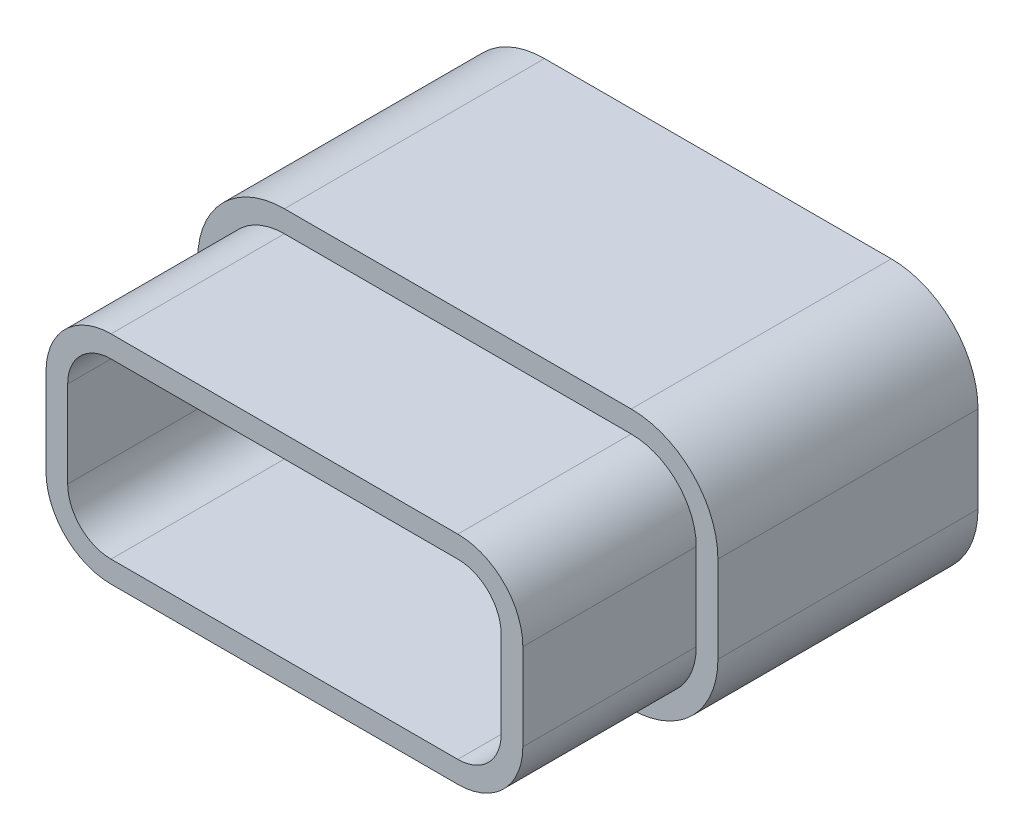
ISO-10303-21;
HEADER;
FILE_DESCRIPTION(('STEP AP214'),'2;1');
FILE_NAME('part.step','',(''),(''),'','','');
FILE_SCHEMA(('AUTOMOTIVE_DESIGN { 1 0 10303 214 1 1 1 1 }'));
ENDSEC;
DATA;
#1=APPLICATION_CONTEXT('core data for automotive mechanical design processes');
#2=APPLICATION_PROTOCOL_DEFINITION('international standard','automotive_design',2000,#1);
#3=PRODUCT_CONTEXT('',#1,'mechanical');
#4=PRODUCT('Part','Part','',(#3));
#5=PRODUCT_RELATED_PRODUCT_CATEGORY('part','',(#4));
#6=PRODUCT_DEFINITION_FORMATION('','',#4);
#7=PRODUCT_DEFINITION_CONTEXT('part definition',#1,'design');
#8=PRODUCT_DEFINITION('design','',#6,#7);
#9=PRODUCT_DEFINITION_SHAPE('','',#8);
#10=(LENGTH_UNIT() NAMED_UNIT(*) SI_UNIT(.MILLI.,.METRE.));
#11=(NAMED_UNIT(*) PLANE_ANGLE_UNIT() SI_UNIT($,.RADIAN.));
#12=(NAMED_UNIT(*) SI_UNIT($,.STERADIAN.) SOLID_ANGLE_UNIT());
#13=UNCERTAINTY_MEASURE_WITH_UNIT(LENGTH_MEASURE(1.E-05),#10,'distance_accuracy_value','');
#14=(GEOMETRIC_REPRESENTATION_CONTEXT(3) GLOBAL_UNCERTAINTY_ASSIGNED_CONTEXT((#13)) GLOBAL_UNIT_ASSIGNED_CONTEXT((#10,
#11,#12)) REPRESENTATION_CONTEXT('',''));
#15=CARTESIAN_POINT('',(0.,0.,0.));
#16=DIRECTION('',(0.,0.,1.));
#17=DIRECTION('',(1.,0.,0.));
#18=AXIS2_PLACEMENT_3D('',#15,#16,#17);
#19=CARTESIAN_POINT('',(40.,-10.,0.));
#20=DIRECTION('',(0.,0.,1.));
#21=DIRECTION('',(1.,0.,0.));
#22=AXIS2_PLACEMENT_3D('',#19,#20,#21);
#23=PLANE('',#22);
#24=CARTESIAN_POINT('',(40.,-10.,0.));
#25=DIRECTION('',(0.,0.,1.));
#26=DIRECTION('',(1.,0.,0.));
#27=AXIS2_PLACEMENT_3D('',#24,#25,#26);
#28=CIRCLE('',#27,20.);
#29=CARTESIAN_POINT('',(39.9999999999999,-30.,0.));
#30=VERTEX_POINT('',#29);
#31=CARTESIAN_POINT('',(60.,-9.99999999999986,0.));
#32=VERTEX_POINT('',#31);
#33=EDGE_CURVE('E815',#30,#32,#28,.T.);
#34=ORIENTED_EDGE('',*,*,#33,.F.);
#35=DIRECTION('',(1.,0.,0.));
#36=VECTOR('',#35,1.);
#37=CARTESIAN_POINT('',(-39.9999999999999,-30.,0.));
#38=LINE('',#37,#36);
#39=CARTESIAN_POINT('',(-39.9999999999999,-30.,0.));
#40=VERTEX_POINT('',#39);
#41=EDGE_CURVE('E895',#40,#30,#38,.T.);
#42=ORIENTED_EDGE('',*,*,#41,.F.);
#43=CARTESIAN_POINT('',(-40.,-10.,0.));
#44=DIRECTION('',(0.,0.,1.));
#45=DIRECTION('',(-1.,0.,0.));
#46=AXIS2_PLACEMENT_3D('',#43,#44,#45);
#47=CIRCLE('',#46,20.);
#48=CARTESIAN_POINT('',(-60.,-10.,0.));
#49=VERTEX_POINT('',#48);
#50=EDGE_CURVE('E891',#49,#40,#47,.T.);
#51=ORIENTED_EDGE('',*,*,#50,.F.);
#52=DIRECTION('',(0.,-1.,0.));
#53=VECTOR('',#52,1.);
#54=CARTESIAN_POINT('',(-60.,-9.99999999999986,0.));
#55=LINE('',#54,#53);
#56=CARTESIAN_POINT('',(-60.,9.99999999999986,0.));
#57=VERTEX_POINT('',#56);
#58=EDGE_CURVE('E887',#57,#49,#55,.T.);
#59=ORIENTED_EDGE('',*,*,#58,.F.);
#60=CARTESIAN_POINT('',(-40.,10.,0.));
#61=DIRECTION('',(0.,0.,1.));
#62=DIRECTION('',(-1.,0.,0.));
#63=AXIS2_PLACEMENT_3D('',#60,#61,#62);
#64=CIRCLE('',#63,20.);
#65=CARTESIAN_POINT('',(-39.9999999999999,30.,0.));
#66=VERTEX_POINT('',#65);
#67=EDGE_CURVE('E883',#66,#57,#64,.T.);
#68=ORIENTED_EDGE('',*,*,#67,.F.);
#69=DIRECTION('',(-1.,0.,0.));
#70=VECTOR('',#69,1.);
#71=CARTESIAN_POINT('',(-39.9999999999999,30.,0.));
#72=LINE('',#71,#70);
#73=CARTESIAN_POINT('',(39.9999999999999,30.,0.));
#74=VERTEX_POINT('',#73);
#75=EDGE_CURVE('E879',#74,#66,#72,.T.);
#76=ORIENTED_EDGE('',*,*,#75,.F.);
#77=CARTESIAN_POINT('',(40.,10.,0.));
#78=DIRECTION('',(0.,0.,1.));
#79=DIRECTION('',(-1.,0.,0.));
#80=AXIS2_PLACEMENT_3D('',#77,#78,#79);
#81=CIRCLE('',#80,20.);
#82=CARTESIAN_POINT('',(60.,9.99999999999986,0.));
#83=VERTEX_POINT('',#82);
#84=EDGE_CURVE('E875',#83,#74,#81,.T.);
#85=ORIENTED_EDGE('',*,*,#84,.F.);
#86=DIRECTION('',(0.,1.,0.));
#87=VECTOR('',#86,1.);
#88=CARTESIAN_POINT('',(60.,-9.99999999999986,0.));
#89=LINE('',#88,#87);
#90=EDGE_CURVE('E871',#32,#83,#89,.T.);
#91=ORIENTED_EDGE('',*,*,#90,.F.);
#92=EDGE_LOOP('',(#34,#42,#51,#59,#68,#76,#85,#91));
#93=FACE_BOUND('',#92,.T.);
#94=DIRECTION('',(0.,-1.,0.));
#95=VECTOR('',#94,1.);
#96=CARTESIAN_POINT('',(-55.,-10.,0.));
#97=LINE('',#96,#95);
#98=CARTESIAN_POINT('',(-55.,9.9999999999999,0.));
#99=VERTEX_POINT('',#98);
#100=CARTESIAN_POINT('',(-55.,-10.,0.));
#101=VERTEX_POINT('',#100);
#102=EDGE_CURVE('E651',#99,#101,#97,.T.);
#103=ORIENTED_EDGE('',*,*,#102,.T.);
#104=CARTESIAN_POINT('',(-40.,-10.,0.));
#105=DIRECTION('',(0.,0.,1.));
#106=DIRECTION('',(1.,0.,0.));
#107=AXIS2_PLACEMENT_3D('',#104,#105,#106);
#108=CIRCLE('',#107,15.);
#109=CARTESIAN_POINT('',(-39.9999999999999,-25.,0.));
#110=VERTEX_POINT('',#109);
#111=EDGE_CURVE('E647',#101,#110,#108,.T.);
#112=ORIENTED_EDGE('',*,*,#111,.T.);
#113=DIRECTION('',(1.,0.,0.));
#114=VECTOR('',#113,1.);
#115=CARTESIAN_POINT('',(40.,-25.,0.));
#116=LINE('',#115,#114);
#117=CARTESIAN_POINT('',(39.9999999999998,-25.,0.));
#118=VERTEX_POINT('',#117);
#119=EDGE_CURVE('E388',#110,#118,#116,.T.);
#120=ORIENTED_EDGE('',*,*,#119,.T.);
#121=CARTESIAN_POINT('',(40.,-10.,0.));
#122=DIRECTION('',(0.,0.,1.));
#123=DIRECTION('',(1.,0.,0.));
#124=AXIS2_PLACEMENT_3D('',#121,#122,#123);
#125=CIRCLE('',#124,15.);
#126=CARTESIAN_POINT('',(55.,-9.99999999999986,0.));
#127=VERTEX_POINT('',#126);
#128=EDGE_CURVE('E641',#118,#127,#125,.T.);
#129=ORIENTED_EDGE('',*,*,#128,.T.);
#130=DIRECTION('',(0.,1.,0.));
#131=VECTOR('',#130,1.);
#132=CARTESIAN_POINT('',(55.,-10.,0.));
#133=LINE('',#132,#131);
#134=CARTESIAN_POINT('',(55.,10.,0.));
#135=VERTEX_POINT('',#134);
#136=EDGE_CURVE('E637',#127,#135,#133,.T.);
#137=ORIENTED_EDGE('',*,*,#136,.T.);
#138=CARTESIAN_POINT('',(40.,10.,0.));
#139=DIRECTION('',(0.,0.,1.));
#140=DIRECTION('',(1.,0.,0.));
#141=AXIS2_PLACEMENT_3D('',#138,#139,#140);
#142=CIRCLE('',#141,15.);
#143=CARTESIAN_POINT('',(39.9999999999999,25.,0.));
#144=VERTEX_POINT('',#143);
#145=EDGE_CURVE('E634',#135,#144,#142,.T.);
#146=ORIENTED_EDGE('',*,*,#145,.T.);
#147=DIRECTION('',(-1.,0.,0.));
#148=VECTOR('',#147,1.);
#149=CARTESIAN_POINT('',(40.,25.,0.));
#150=LINE('',#149,#148);
#151=CARTESIAN_POINT('',(-39.9999999999999,25.,0.));
#152=VERTEX_POINT('',#151);
#153=EDGE_CURVE('E586',#144,#152,#150,.T.);
#154=ORIENTED_EDGE('',*,*,#153,.T.);
#155=CARTESIAN_POINT('',(-40.,10.,0.));
#156=DIRECTION('',(0.,0.,1.));
#157=DIRECTION('',(1.,0.,0.));
#158=AXIS2_PLACEMENT_3D('',#155,#156,#157);
#159=CIRCLE('',#158,15.);
#160=EDGE_CURVE('E607',#152,#99,#159,.T.);
#161=ORIENTED_EDGE('',*,*,#160,.T.);
#162=EDGE_LOOP('',(#103,#112,#120,#129,#137,#146,#154,#161));
#163=FACE_BOUND('',#162,.T.);
#164=ADVANCED_FACE('F372',(#93,#163),#23,.F.);
#165=CARTESIAN_POINT('',(40.,-10.,100.));
#166=DIRECTION('',(0.,0.,-1.));
#167=DIRECTION('',(-1.,0.,0.));
#168=AXIS2_PLACEMENT_3D('',#165,#166,#167);
#169=CYLINDRICAL_SURFACE('',#168,20.);
#170=CARTESIAN_POINT('',(40.,-10.,60.));
#171=DIRECTION('',(0.,0.,1.));
#172=DIRECTION('',(1.,0.,0.));
#173=AXIS2_PLACEMENT_3D('',#170,#171,#172);
#174=CIRCLE('',#173,20.);
#175=CARTESIAN_POINT('',(39.9999999999999,-30.,60.));
#176=VERTEX_POINT('',#175);
#177=CARTESIAN_POINT('',(60.,-9.99999999999986,60.));
#178=VERTEX_POINT('',#177);
#179=EDGE_CURVE('E699',#176,#178,#174,.T.);
#180=ORIENTED_EDGE('',*,*,#179,.F.);
#181=DIRECTION('',(0.,0.,-1.));
#182=VECTOR('',#181,1.);
#183=CARTESIAN_POINT('',(39.9999999999999,-30.,100.));
#184=LINE('',#183,#182);
#185=EDGE_CURVE('E899',#176,#30,#184,.T.);
#186=ORIENTED_EDGE('',*,*,#185,.T.);
#187=ORIENTED_EDGE('',*,*,#33,.T.);
#188=DIRECTION('',(0.,0.,-1.));
#189=VECTOR('',#188,1.);
#190=CARTESIAN_POINT('',(60.,-9.99999999999986,100.));
#191=LINE('',#190,#189);
#192=EDGE_CURVE('E381',#178,#32,#191,.T.);
#193=ORIENTED_EDGE('',*,*,#192,.F.);
#194=EDGE_LOOP('',(#180,#186,#187,#193));
#195=FACE_BOUND('',#194,.T.);
#196=ADVANCED_FACE('F374',(#195),#169,.T.);
#197=CARTESIAN_POINT('',(60.,-9.99999999999986,100.));
#198=DIRECTION('',(-1.,0.,0.));
#199=DIRECTION('',(0.,0.,1.));
#200=AXIS2_PLACEMENT_3D('',#197,#198,#199);
#201=PLANE('',#200);
#202=DIRECTION('',(0.,1.,0.));
#203=VECTOR('',#202,1.);
#204=CARTESIAN_POINT('',(60.,-9.99999999999986,60.));
#205=LINE('',#204,#203);
#206=CARTESIAN_POINT('',(60.,9.99999999999986,60.));
#207=VERTEX_POINT('',#206);
#208=EDGE_CURVE('E702',#178,#207,#205,.T.);
#209=ORIENTED_EDGE('',*,*,#208,.F.);
#210=ORIENTED_EDGE('',*,*,#192,.T.);
#211=ORIENTED_EDGE('',*,*,#90,.T.);
#212=DIRECTION('',(0.,0.,-1.));
#213=VECTOR('',#212,1.);
#214=CARTESIAN_POINT('',(60.,9.99999999999986,100.));
#215=LINE('',#214,#213);
#216=EDGE_CURVE('E917',#207,#83,#215,.T.);
#217=ORIENTED_EDGE('',*,*,#216,.F.);
#218=EDGE_LOOP('',(#209,#210,#211,#217));
#219=FACE_BOUND('',#218,.T.);
#220=ADVANCED_FACE('F924',(#219),#201,.F.);
#221=CARTESIAN_POINT('',(40.,10.,100.));
#222=DIRECTION('',(0.,0.,-1.));
#223=DIRECTION('',(-1.,0.,0.));
#224=AXIS2_PLACEMENT_3D('',#221,#222,#223);
#225=CYLINDRICAL_SURFACE('',#224,20.);
#226=CARTESIAN_POINT('',(40.,10.,60.));
#227=DIRECTION('',(0.,0.,1.));
#228=DIRECTION('',(-1.,0.,0.));
#229=AXIS2_PLACEMENT_3D('',#226,#227,#228);
#230=CIRCLE('',#229,20.);
#231=CARTESIAN_POINT('',(39.9999999999999,30.,60.));
#232=VERTEX_POINT('',#231);
#233=EDGE_CURVE('E706',#207,#232,#230,.T.);
#234=ORIENTED_EDGE('',*,*,#233,.F.);
#235=ORIENTED_EDGE('',*,*,#216,.T.);
#236=ORIENTED_EDGE('',*,*,#84,.T.);
#237=DIRECTION('',(0.,0.,-1.));
#238=VECTOR('',#237,1.);
#239=CARTESIAN_POINT('',(39.9999999999999,30.,100.));
#240=LINE('',#239,#238);
#241=EDGE_CURVE('E914',#232,#74,#240,.T.);
#242=ORIENTED_EDGE('',*,*,#241,.F.);
#243=EDGE_LOOP('',(#234,#235,#236,#242));
#244=FACE_BOUND('',#243,.T.);
#245=ADVANCED_FACE('F960',(#244),#225,.T.);
#246=CARTESIAN_POINT('',(-39.9999999999999,30.,100.));
#247=DIRECTION('',(0.,-1.,0.));
#248=DIRECTION('',(0.,0.,-1.));
#249=AXIS2_PLACEMENT_3D('',#246,#247,#248);
#250=PLANE('',#249);
#251=DIRECTION('',(-1.,0.,0.));
#252=VECTOR('',#251,1.);
#253=CARTESIAN_POINT('',(-39.9999999999999,30.,60.));
#254=LINE('',#253,#252);
#255=CARTESIAN_POINT('',(-39.9999999999999,30.,60.));
#256=VERTEX_POINT('',#255);
#257=EDGE_CURVE('E709',#232,#256,#254,.T.);
#258=ORIENTED_EDGE('',*,*,#257,.F.);
#259=ORIENTED_EDGE('',*,*,#241,.T.);
#260=ORIENTED_EDGE('',*,*,#75,.T.);
#261=DIRECTION('',(0.,0.,-1.));
#262=VECTOR('',#261,1.);
#263=CARTESIAN_POINT('',(-39.9999999999999,30.,100.));
#264=LINE('',#263,#262);
#265=EDGE_CURVE('E911',#256,#66,#264,.T.);
#266=ORIENTED_EDGE('',*,*,#265,.F.);
#267=EDGE_LOOP('',(#258,#259,#260,#266));
#268=FACE_BOUND('',#267,.T.);
#269=ADVANCED_FACE('F956',(#268),#250,.F.);
#270=CARTESIAN_POINT('',(-40.,10.,100.));
#271=DIRECTION('',(0.,0.,-1.));
#272=DIRECTION('',(-1.,0.,0.));
#273=AXIS2_PLACEMENT_3D('',#270,#271,#272);
#274=CYLINDRICAL_SURFACE('',#273,20.);
#275=CARTESIAN_POINT('',(-40.,10.,60.));
#276=DIRECTION('',(0.,0.,1.));
#277=DIRECTION('',(-1.,0.,0.));
#278=AXIS2_PLACEMENT_3D('',#275,#276,#277);
#279=CIRCLE('',#278,20.);
#280=CARTESIAN_POINT('',(-60.,9.99999999999986,60.));
#281=VERTEX_POINT('',#280);
#282=EDGE_CURVE('E712',#256,#281,#279,.T.);
#283=ORIENTED_EDGE('',*,*,#282,.F.);
#284=ORIENTED_EDGE('',*,*,#265,.T.);
#285=ORIENTED_EDGE('',*,*,#67,.T.);
#286=DIRECTION('',(0.,0.,-1.));
#287=VECTOR('',#286,1.);
#288=CARTESIAN_POINT('',(-60.,9.99999999999986,100.));
#289=LINE('',#288,#287);
#290=EDGE_CURVE('E908',#281,#57,#289,.T.);
#291=ORIENTED_EDGE('',*,*,#290,.F.);
#292=EDGE_LOOP('',(#283,#284,#285,#291));
#293=FACE_BOUND('',#292,.T.);
#294=ADVANCED_FACE('F952',(#293),#274,.T.);
#295=CARTESIAN_POINT('',(-60.,-9.99999999999986,100.));
#296=DIRECTION('',(1.,0.,0.));
#297=DIRECTION('',(0.,0.,-1.));
#298=AXIS2_PLACEMENT_3D('',#295,#296,#297);
#299=PLANE('',#298);
#300=DIRECTION('',(0.,-1.,0.));
#301=VECTOR('',#300,1.);
#302=CARTESIAN_POINT('',(-60.,-9.99999999999986,60.));
#303=LINE('',#302,#301);
#304=CARTESIAN_POINT('',(-60.,-10.,60.));
#305=VERTEX_POINT('',#304);
#306=EDGE_CURVE('E715',#281,#305,#303,.T.);
#307=ORIENTED_EDGE('',*,*,#306,.F.);
#308=ORIENTED_EDGE('',*,*,#290,.T.);
#309=ORIENTED_EDGE('',*,*,#58,.T.);
#310=DIRECTION('',(0.,0.,-1.));
#311=VECTOR('',#310,1.);
#312=CARTESIAN_POINT('',(-60.,-10.,100.));
#313=LINE('',#312,#311);
#314=EDGE_CURVE('E905',#305,#49,#313,.T.);
#315=ORIENTED_EDGE('',*,*,#314,.F.);
#316=EDGE_LOOP('',(#307,#308,#309,#315));
#317=FACE_BOUND('',#316,.T.);
#318=ADVANCED_FACE('F948',(#317),#299,.F.);
#319=CARTESIAN_POINT('',(-40.,-10.,100.));
#320=DIRECTION('',(0.,0.,-1.));
#321=DIRECTION('',(-1.,0.,0.));
#322=AXIS2_PLACEMENT_3D('',#319,#320,#321);
#323=CYLINDRICAL_SURFACE('',#322,20.);
#324=CARTESIAN_POINT('',(-40.,-10.,60.));
#325=DIRECTION('',(0.,0.,1.));
#326=DIRECTION('',(-1.,0.,0.));
#327=AXIS2_PLACEMENT_3D('',#324,#325,#326);
#328=CIRCLE('',#327,20.);
#329=CARTESIAN_POINT('',(-39.9999999999999,-30.,60.));
#330=VERTEX_POINT('',#329);
#331=EDGE_CURVE('E718',#305,#330,#328,.T.);
#332=ORIENTED_EDGE('',*,*,#331,.F.);
#333=ORIENTED_EDGE('',*,*,#314,.T.);
#334=ORIENTED_EDGE('',*,*,#50,.T.);
#335=DIRECTION('',(0.,0.,-1.));
#336=VECTOR('',#335,1.);
#337=CARTESIAN_POINT('',(-39.9999999999999,-30.,100.));
#338=LINE('',#337,#336);
#339=EDGE_CURVE('E902',#330,#40,#338,.T.);
#340=ORIENTED_EDGE('',*,*,#339,.F.);
#341=EDGE_LOOP('',(#332,#333,#334,#340));
#342=FACE_BOUND('',#341,.T.);
#343=ADVANCED_FACE('F944',(#342),#323,.T.);
#344=CARTESIAN_POINT('',(-39.9999999999999,-30.,100.));
#345=DIRECTION('',(0.,1.,0.));
#346=DIRECTION('',(0.,0.,1.));
#347=AXIS2_PLACEMENT_3D('',#344,#345,#346);
#348=PLANE('',#347);
#349=DIRECTION('',(1.,0.,0.));
#350=VECTOR('',#349,1.);
#351=CARTESIAN_POINT('',(-39.9999999999999,-30.,60.));
#352=LINE('',#351,#350);
#353=EDGE_CURVE('E721',#330,#176,#352,.T.);
#354=ORIENTED_EDGE('',*,*,#353,.F.);
#355=ORIENTED_EDGE('',*,*,#339,.T.);
#356=ORIENTED_EDGE('',*,*,#41,.T.);
#357=ORIENTED_EDGE('',*,*,#185,.F.);
#358=EDGE_LOOP('',(#354,#355,#356,#357));
#359=FACE_BOUND('',#358,.T.);
#360=ADVANCED_FACE('F937',(#359),#348,.F.);
#361=CARTESIAN_POINT('',(40.,-10.,100.));
#362=DIRECTION('',(0.,0.,1.));
#363=DIRECTION('',(1.,0.,0.));
#364=AXIS2_PLACEMENT_3D('',#361,#362,#363);
#365=PLANE('',#364);
#366=CARTESIAN_POINT('',(40.,10.,100.));
#367=DIRECTION('',(0.,0.,1.));
#368=DIRECTION('',(1.,0.,0.));
#369=AXIS2_PLACEMENT_3D('',#366,#367,#368);
#370=CIRCLE('',#369,15.);
#371=CARTESIAN_POINT('',(39.9999999999999,25.,100.));
#372=VERTEX_POINT('',#371);
#373=CARTESIAN_POINT('',(55.,10.,100.));
#374=VERTEX_POINT('',#373);
#375=EDGE_CURVE('E779',#372,#374,#370,.F.);
#376=ORIENTED_EDGE('',*,*,#375,.F.);
#377=DIRECTION('',(1.,0.,0.));
#378=VECTOR('',#377,1.);
#379=CARTESIAN_POINT('',(40.,25.,100.));
#380=LINE('',#379,#378);
#381=CARTESIAN_POINT('',(-39.9999999999999,25.,100.));
#382=VERTEX_POINT('',#381);
#383=EDGE_CURVE('E775',#382,#372,#380,.T.);
#384=ORIENTED_EDGE('',*,*,#383,.F.);
#385=CARTESIAN_POINT('',(-40.,10.,100.));
#386=DIRECTION('',(0.,0.,1.));
#387=DIRECTION('',(1.,0.,0.));
#388=AXIS2_PLACEMENT_3D('',#385,#386,#387);
#389=CIRCLE('',#388,15.);
#390=CARTESIAN_POINT('',(-55.,9.99999999999989,100.));
#391=VERTEX_POINT('',#390);
#392=EDGE_CURVE('E772',#391,#382,#389,.F.);
#393=ORIENTED_EDGE('',*,*,#392,.F.);
#394=DIRECTION('',(0.,1.,0.));
#395=VECTOR('',#394,1.);
#396=CARTESIAN_POINT('',(-55.,-10.,100.));
#397=LINE('',#396,#395);
#398=CARTESIAN_POINT('',(-55.,-10.,100.));
#399=VERTEX_POINT('',#398);
#400=EDGE_CURVE('E768',#399,#391,#397,.T.);
#401=ORIENTED_EDGE('',*,*,#400,.F.);
#402=CARTESIAN_POINT('',(-40.,-10.,100.));
#403=DIRECTION('',(0.,0.,1.));
#404=DIRECTION('',(1.,0.,0.));
#405=AXIS2_PLACEMENT_3D('',#402,#403,#404);
#406=CIRCLE('',#405,15.);
#407=CARTESIAN_POINT('',(-39.9999999999999,-25.,100.));
#408=VERTEX_POINT('',#407);
#409=EDGE_CURVE('E760',#408,#399,#406,.F.);
#410=ORIENTED_EDGE('',*,*,#409,.F.);
#411=DIRECTION('',(-1.,0.,0.));
#412=VECTOR('',#411,1.);
#413=CARTESIAN_POINT('',(40.,-25.,100.));
#414=LINE('',#413,#412);
#415=CARTESIAN_POINT('',(39.9999999999999,-25.,100.));
#416=VERTEX_POINT('',#415);
#417=EDGE_CURVE('E698',#416,#408,#414,.T.);
#418=ORIENTED_EDGE('',*,*,#417,.F.);
#419=CARTESIAN_POINT('',(40.,-10.,100.));
#420=DIRECTION('',(0.,0.,1.));
#421=DIRECTION('',(1.,0.,0.));
#422=AXIS2_PLACEMENT_3D('',#419,#420,#421);
#423=CIRCLE('',#422,15.);
#424=CARTESIAN_POINT('',(55.,-10.,100.));
#425=VERTEX_POINT('',#424);
#426=EDGE_CURVE('E703',#425,#416,#423,.F.);
#427=ORIENTED_EDGE('',*,*,#426,.F.);
#428=DIRECTION('',(0.,-1.,0.));
#429=VECTOR('',#428,1.);
#430=CARTESIAN_POINT('',(55.,-10.,100.));
#431=LINE('',#430,#429);
#432=EDGE_CURVE('E764',#374,#425,#431,.T.);
#433=ORIENTED_EDGE('',*,*,#432,.F.);
#434=EDGE_LOOP('',(#376,#384,#393,#401,#410,#418,#427,#433));
#435=FACE_BOUND('',#434,.T.);
#436=CARTESIAN_POINT('',(40.,-10.,100.));
#437=DIRECTION('',(0.,0.,1.));
#438=DIRECTION('',(1.,0.,0.));
#439=AXIS2_PLACEMENT_3D('',#436,#437,#438);
#440=CIRCLE('',#439,10.);
#441=CARTESIAN_POINT('',(39.9999999999998,-20.,100.));
#442=VERTEX_POINT('',#441);
#443=CARTESIAN_POINT('',(50.,-9.99999999999986,100.));
#444=VERTEX_POINT('',#443);
#445=EDGE_CURVE('E793',#442,#444,#440,.T.);
#446=ORIENTED_EDGE('',*,*,#445,.F.);
#447=DIRECTION('',(1.,0.,0.));
#448=VECTOR('',#447,1.);
#449=CARTESIAN_POINT('',(-39.9999999999999,-20.,100.));
#450=LINE('',#449,#448);
#451=CARTESIAN_POINT('',(-39.9999999999999,-20.,100.));
#452=VERTEX_POINT('',#451);
#453=EDGE_CURVE('E822',#452,#442,#450,.T.);
#454=ORIENTED_EDGE('',*,*,#453,.F.);
#455=CARTESIAN_POINT('',(-40.,-10.,100.));
#456=DIRECTION('',(0.,0.,1.));
#457=DIRECTION('',(1.,0.,0.));
#458=AXIS2_PLACEMENT_3D('',#455,#456,#457);
#459=CIRCLE('',#458,10.);
#460=CARTESIAN_POINT('',(-50.,-10.,100.));
#461=VERTEX_POINT('',#460);
#462=EDGE_CURVE('E862',#461,#452,#459,.T.);
#463=ORIENTED_EDGE('',*,*,#462,.F.);
#464=DIRECTION('',(0.,-1.,0.));
#465=VECTOR('',#464,1.);
#466=CARTESIAN_POINT('',(-50.,-9.99999999999986,100.));
#467=LINE('',#466,#465);
#468=CARTESIAN_POINT('',(-50.,9.99999999999993,100.));
#469=VERTEX_POINT('',#468);
#470=EDGE_CURVE('E859',#469,#461,#467,.T.);
#471=ORIENTED_EDGE('',*,*,#470,.F.);
#472=CARTESIAN_POINT('',(-40.,10.,100.));
#473=DIRECTION('',(0.,0.,1.));
#474=DIRECTION('',(1.,0.,0.));
#475=AXIS2_PLACEMENT_3D('',#472,#473,#474);
#476=CIRCLE('',#475,10.);
#477=CARTESIAN_POINT('',(-39.9999999999999,20.,100.));
#478=VERTEX_POINT('',#477);
#479=EDGE_CURVE('E856',#478,#469,#476,.T.);
#480=ORIENTED_EDGE('',*,*,#479,.F.);
#481=DIRECTION('',(-1.,0.,0.));
#482=VECTOR('',#481,1.);
#483=CARTESIAN_POINT('',(-39.9999999999999,20.,100.));
#484=LINE('',#483,#482);
#485=CARTESIAN_POINT('',(39.9999999999999,20.,100.));
#486=VERTEX_POINT('',#485);
#487=EDGE_CURVE('E853',#486,#478,#484,.T.);
#488=ORIENTED_EDGE('',*,*,#487,.F.);
#489=CARTESIAN_POINT('',(40.,10.,100.));
#490=DIRECTION('',(0.,0.,1.));
#491=DIRECTION('',(1.,0.,0.));
#492=AXIS2_PLACEMENT_3D('',#489,#490,#491);
#493=CIRCLE('',#492,10.);
#494=CARTESIAN_POINT('',(50.,9.99999999999986,100.));
#495=VERTEX_POINT('',#494);
#496=EDGE_CURVE('E850',#495,#486,#493,.T.);
#497=ORIENTED_EDGE('',*,*,#496,.F.);
#498=DIRECTION('',(0.,1.,0.));
#499=VECTOR('',#498,1.);
#500=CARTESIAN_POINT('',(50.,-9.99999999999986,100.));
#501=LINE('',#500,#499);
#502=EDGE_CURVE('E847',#444,#495,#501,.T.);
#503=ORIENTED_EDGE('',*,*,#502,.F.);
#504=EDGE_LOOP('',(#446,#454,#463,#471,#480,#488,#497,#503));
#505=FACE_BOUND('',#504,.T.);
#506=ADVANCED_FACE('F1000',(#435,#505),#365,.T.);
#507=CARTESIAN_POINT('',(40.,-10.,100.));
#508=DIRECTION('',(0.,0.,-1.));
#509=DIRECTION('',(-1.,0.,0.));
#510=AXIS2_PLACEMENT_3D('',#507,#508,#509);
#511=CYLINDRICAL_SURFACE('',#510,10.);
#512=CARTESIAN_POINT('',(40.,-10.,40.));
#513=DIRECTION('',(0.,0.,1.));
#514=DIRECTION('',(1.,0.,0.));
#515=AXIS2_PLACEMENT_3D('',#512,#513,#514);
#516=CIRCLE('',#515,10.);
#517=CARTESIAN_POINT('',(39.9999999999998,-20.,40.));
#518=VERTEX_POINT('',#517);
#519=CARTESIAN_POINT('',(50.,-9.99999999999986,40.));
#520=VERTEX_POINT('',#519);
#521=EDGE_CURVE('E695',#518,#520,#516,.T.);
#522=ORIENTED_EDGE('',*,*,#521,.F.);
#523=DIRECTION('',(0.,0.,-1.));
#524=VECTOR('',#523,1.);
#525=CARTESIAN_POINT('',(39.9999999999999,-20.,100.));
#526=LINE('',#525,#524);
#527=EDGE_CURVE('E817',#442,#518,#526,.T.);
#528=ORIENTED_EDGE('',*,*,#527,.F.);
#529=ORIENTED_EDGE('',*,*,#445,.T.);
#530=DIRECTION('',(0.,0.,1.));
#531=VECTOR('',#530,1.);
#532=CARTESIAN_POINT('',(50.,-9.99999999999986,100.));
#533=LINE('',#532,#531);
#534=EDGE_CURVE('E811',#444,#520,#533,.F.);
#535=ORIENTED_EDGE('',*,*,#534,.T.);
#536=EDGE_LOOP('',(#522,#528,#529,#535));
#537=FACE_BOUND('',#536,.T.);
#538=ADVANCED_FACE('F1003',(#537),#511,.F.);
#539=CARTESIAN_POINT('',(50.,-9.99999999999986,100.));
#540=DIRECTION('',(-1.,0.,0.));
#541=DIRECTION('',(0.,0.,1.));
#542=AXIS2_PLACEMENT_3D('',#539,#540,#541);
#543=PLANE('',#542);
#544=DIRECTION('',(0.,1.,0.));
#545=VECTOR('',#544,1.);
#546=CARTESIAN_POINT('',(50.,-9.99999999999986,40.));
#547=LINE('',#546,#545);
#548=CARTESIAN_POINT('',(50.,10.,40.));
#549=VERTEX_POINT('',#548);
#550=EDGE_CURVE('E692',#520,#549,#547,.T.);
#551=ORIENTED_EDGE('',*,*,#550,.F.);
#552=ORIENTED_EDGE('',*,*,#534,.F.);
#553=ORIENTED_EDGE('',*,*,#502,.T.);
#554=DIRECTION('',(0.,0.,-1.));
#555=VECTOR('',#554,1.);
#556=CARTESIAN_POINT('',(50.,9.99999999999993,100.));
#557=LINE('',#556,#555);
#558=EDGE_CURVE('E816',#495,#549,#557,.T.);
#559=ORIENTED_EDGE('',*,*,#558,.T.);
#560=EDGE_LOOP('',(#551,#552,#553,#559));
#561=FACE_BOUND('',#560,.T.);
#562=ADVANCED_FACE('F1016',(#561),#543,.T.);
#563=CARTESIAN_POINT('',(40.,10.,100.));
#564=DIRECTION('',(0.,0.,-1.));
#565=DIRECTION('',(-1.,0.,0.));
#566=AXIS2_PLACEMENT_3D('',#563,#564,#565);
#567=CYLINDRICAL_SURFACE('',#566,10.);
#568=CARTESIAN_POINT('',(40.,10.,40.));
#569=DIRECTION('',(0.,0.,1.));
#570=DIRECTION('',(1.,0.,0.));
#571=AXIS2_PLACEMENT_3D('',#568,#569,#570);
#572=CIRCLE('',#571,10.);
#573=CARTESIAN_POINT('',(39.9999999999999,20.,40.));
#574=VERTEX_POINT('',#573);
#575=EDGE_CURVE('E689',#549,#574,#572,.T.);
#576=ORIENTED_EDGE('',*,*,#575,.F.);
#577=ORIENTED_EDGE('',*,*,#558,.F.);
#578=ORIENTED_EDGE('',*,*,#496,.T.);
#579=DIRECTION('',(0.,0.,-1.));
#580=VECTOR('',#579,1.);
#581=CARTESIAN_POINT('',(39.9999999999998,20.,100.));
#582=LINE('',#581,#580);
#583=EDGE_CURVE('E826',#486,#574,#582,.T.);
#584=ORIENTED_EDGE('',*,*,#583,.T.);
#585=EDGE_LOOP('',(#576,#577,#578,#584));
#586=FACE_BOUND('',#585,.T.);
#587=ADVANCED_FACE('F1021',(#586),#567,.F.);
#588=CARTESIAN_POINT('',(-39.9999999999999,20.,100.));
#589=DIRECTION('',(0.,-1.,0.));
#590=DIRECTION('',(0.,0.,-1.));
#591=AXIS2_PLACEMENT_3D('',#588,#589,#590);
#592=PLANE('',#591);
#593=DIRECTION('',(-1.,0.,0.));
#594=VECTOR('',#593,1.);
#595=CARTESIAN_POINT('',(-39.9999999999999,20.,40.));
#596=LINE('',#595,#594);
#597=CARTESIAN_POINT('',(-39.9999999999999,20.,40.));
#598=VERTEX_POINT('',#597);
#599=EDGE_CURVE('E686',#574,#598,#596,.T.);
#600=ORIENTED_EDGE('',*,*,#599,.F.);
#601=ORIENTED_EDGE('',*,*,#583,.F.);
#602=ORIENTED_EDGE('',*,*,#487,.T.);
#603=DIRECTION('',(0.,0.,-1.));
#604=VECTOR('',#603,1.);
#605=CARTESIAN_POINT('',(-39.9999999999999,20.,100.));
#606=LINE('',#605,#604);
#607=EDGE_CURVE('E830',#478,#598,#606,.T.);
#608=ORIENTED_EDGE('',*,*,#607,.T.);
#609=EDGE_LOOP('',(#600,#601,#602,#608));
#610=FACE_BOUND('',#609,.T.);
#611=ADVANCED_FACE('F1025',(#610),#592,.T.);
#612=CARTESIAN_POINT('',(-40.,10.,100.));
#613=DIRECTION('',(0.,0.,-1.));
#614=DIRECTION('',(-1.,0.,0.));
#615=AXIS2_PLACEMENT_3D('',#612,#613,#614);
#616=CYLINDRICAL_SURFACE('',#615,10.);
#617=CARTESIAN_POINT('',(-40.,10.,40.));
#618=DIRECTION('',(0.,0.,1.));
#619=DIRECTION('',(1.,0.,0.));
#620=AXIS2_PLACEMENT_3D('',#617,#618,#619);
#621=CIRCLE('',#620,10.);
#622=CARTESIAN_POINT('',(-50.,9.99999999999993,40.));
#623=VERTEX_POINT('',#622);
#624=EDGE_CURVE('E683',#598,#623,#621,.T.);
#625=ORIENTED_EDGE('',*,*,#624,.F.);
#626=ORIENTED_EDGE('',*,*,#607,.F.);
#627=ORIENTED_EDGE('',*,*,#479,.T.);
#628=DIRECTION('',(0.,0.,-1.));
#629=VECTOR('',#628,1.);
#630=CARTESIAN_POINT('',(-50.,9.99999999999986,100.));
#631=LINE('',#630,#629);
#632=EDGE_CURVE('E834',#469,#623,#631,.T.);
#633=ORIENTED_EDGE('',*,*,#632,.T.);
#634=EDGE_LOOP('',(#625,#626,#627,#633));
#635=FACE_BOUND('',#634,.T.);
#636=ADVANCED_FACE('F1032',(#635),#616,.F.);
#637=CARTESIAN_POINT('',(-50.,-9.99999999999986,100.));
#638=DIRECTION('',(1.,0.,0.));
#639=DIRECTION('',(0.,0.,-1.));
#640=AXIS2_PLACEMENT_3D('',#637,#638,#639);
#641=PLANE('',#640);
#642=DIRECTION('',(0.,-1.,0.));
#643=VECTOR('',#642,1.);
#644=CARTESIAN_POINT('',(-50.,-9.99999999999986,40.));
#645=LINE('',#644,#643);
#646=CARTESIAN_POINT('',(-50.,-10.,40.));
#647=VERTEX_POINT('',#646);
#648=EDGE_CURVE('E680',#623,#647,#645,.T.);
#649=ORIENTED_EDGE('',*,*,#648,.F.);
#650=ORIENTED_EDGE('',*,*,#632,.F.);
#651=ORIENTED_EDGE('',*,*,#470,.T.);
#652=DIRECTION('',(0.,0.,-1.));
#653=VECTOR('',#652,1.);
#654=CARTESIAN_POINT('',(-50.,-10.,100.));
#655=LINE('',#654,#653);
#656=EDGE_CURVE('E838',#461,#647,#655,.T.);
#657=ORIENTED_EDGE('',*,*,#656,.T.);
#658=EDGE_LOOP('',(#649,#650,#651,#657));
#659=FACE_BOUND('',#658,.T.);
#660=ADVANCED_FACE('F1035',(#659),#641,.T.);
#661=CARTESIAN_POINT('',(-40.,-10.,100.));
#662=DIRECTION('',(0.,0.,-1.));
#663=DIRECTION('',(-1.,0.,0.));
#664=AXIS2_PLACEMENT_3D('',#661,#662,#663);
#665=CYLINDRICAL_SURFACE('',#664,10.);
#666=CARTESIAN_POINT('',(-40.,-10.,40.));
#667=DIRECTION('',(0.,0.,1.));
#668=DIRECTION('',(1.,0.,0.));
#669=AXIS2_PLACEMENT_3D('',#666,#667,#668);
#670=CIRCLE('',#669,10.);
#671=CARTESIAN_POINT('',(-39.9999999999999,-20.,40.));
#672=VERTEX_POINT('',#671);
#673=EDGE_CURVE('E395',#647,#672,#670,.T.);
#674=ORIENTED_EDGE('',*,*,#673,.F.);
#675=ORIENTED_EDGE('',*,*,#656,.F.);
#676=ORIENTED_EDGE('',*,*,#462,.T.);
#677=DIRECTION('',(0.,0.,1.));
#678=VECTOR('',#677,1.);
#679=CARTESIAN_POINT('',(-39.9999999999999,-20.,100.));
#680=LINE('',#679,#678);
#681=EDGE_CURVE('E821',#452,#672,#680,.F.);
#682=ORIENTED_EDGE('',*,*,#681,.T.);
#683=EDGE_LOOP('',(#674,#675,#676,#682));
#684=FACE_BOUND('',#683,.T.);
#685=ADVANCED_FACE('F1038',(#684),#665,.F.);
#686=CARTESIAN_POINT('',(-39.9999999999999,-20.,100.));
#687=DIRECTION('',(0.,1.,0.));
#688=DIRECTION('',(0.,0.,1.));
#689=AXIS2_PLACEMENT_3D('',#686,#687,#688);
#690=PLANE('',#689);
#691=DIRECTION('',(1.,0.,0.));
#692=VECTOR('',#691,1.);
#693=CARTESIAN_POINT('',(-39.9999999999999,-20.,40.));
#694=LINE('',#693,#692);
#695=EDGE_CURVE('E13',#672,#518,#694,.T.);
#696=ORIENTED_EDGE('',*,*,#695,.F.);
#697=ORIENTED_EDGE('',*,*,#681,.F.);
#698=ORIENTED_EDGE('',*,*,#453,.T.);
#699=ORIENTED_EDGE('',*,*,#527,.T.);
#700=EDGE_LOOP('',(#696,#697,#698,#699));
#701=FACE_BOUND('',#700,.T.);
#702=ADVANCED_FACE('F1040',(#701),#690,.T.);
#703=CARTESIAN_POINT('',(40.,10.,60.));
#704=DIRECTION('',(0.,0.,1.));
#705=DIRECTION('',(1.,0.,0.));
#706=AXIS2_PLACEMENT_3D('',#703,#704,#705);
#707=CYLINDRICAL_SURFACE('',#706,15.);
#708=ORIENTED_EDGE('',*,*,#375,.T.);
#709=DIRECTION('',(0.,0.,1.));
#710=VECTOR('',#709,1.);
#711=CARTESIAN_POINT('',(55.,10.,60.));
#712=LINE('',#711,#710);
#713=CARTESIAN_POINT('',(55.,10.,60.));
#714=VERTEX_POINT('',#713);
#715=EDGE_CURVE('E789',#714,#374,#712,.T.);
#716=ORIENTED_EDGE('',*,*,#715,.F.);
#717=CARTESIAN_POINT('',(40.,10.,60.));
#718=DIRECTION('',(0.,0.,1.));
#719=DIRECTION('',(1.,0.,0.));
#720=AXIS2_PLACEMENT_3D('',#717,#718,#719);
#721=CIRCLE('',#720,15.);
#722=CARTESIAN_POINT('',(39.9999999999999,25.,60.));
#723=VERTEX_POINT('',#722);
#724=EDGE_CURVE('E750',#723,#714,#721,.F.);
#725=ORIENTED_EDGE('',*,*,#724,.F.);
#726=DIRECTION('',(0.,0.,1.));
#727=VECTOR('',#726,1.);
#728=CARTESIAN_POINT('',(39.9999999999999,25.,60.));
#729=LINE('',#728,#727);
#730=EDGE_CURVE('E733',#723,#372,#729,.T.);
#731=ORIENTED_EDGE('',*,*,#730,.T.);
#732=EDGE_LOOP('',(#708,#716,#725,#731));
#733=FACE_BOUND('',#732,.T.);
#734=ADVANCED_FACE('F973',(#733),#707,.T.);
#735=CARTESIAN_POINT('',(55.,-10.,60.));
#736=DIRECTION('',(-1.,0.,0.));
#737=DIRECTION('',(0.,0.,1.));
#738=AXIS2_PLACEMENT_3D('',#735,#736,#737);
#739=PLANE('',#738);
#740=ORIENTED_EDGE('',*,*,#432,.T.);
#741=DIRECTION('',(0.,0.,1.));
#742=VECTOR('',#741,1.);
#743=CARTESIAN_POINT('',(55.,-10.,60.));
#744=LINE('',#743,#742);
#745=CARTESIAN_POINT('',(55.,-10.,60.));
#746=VERTEX_POINT('',#745);
#747=EDGE_CURVE('E786',#746,#425,#744,.T.);
#748=ORIENTED_EDGE('',*,*,#747,.F.);
#749=DIRECTION('',(0.,-1.,0.));
#750=VECTOR('',#749,1.);
#751=CARTESIAN_POINT('',(55.,-10.,60.));
#752=LINE('',#751,#750);
#753=EDGE_CURVE('E734',#714,#746,#752,.T.);
#754=ORIENTED_EDGE('',*,*,#753,.F.);
#755=ORIENTED_EDGE('',*,*,#715,.T.);
#756=EDGE_LOOP('',(#740,#748,#754,#755));
#757=FACE_BOUND('',#756,.T.);
#758=ADVANCED_FACE('F977',(#757),#739,.F.);
#759=CARTESIAN_POINT('',(40.,-10.,60.));
#760=DIRECTION('',(0.,0.,1.));
#761=DIRECTION('',(1.,0.,0.));
#762=AXIS2_PLACEMENT_3D('',#759,#760,#761);
#763=CYLINDRICAL_SURFACE('',#762,15.);
#764=ORIENTED_EDGE('',*,*,#426,.T.);
#765=DIRECTION('',(0.,0.,1.));
#766=VECTOR('',#765,1.);
#767=CARTESIAN_POINT('',(39.9999999999999,-25.,60.));
#768=LINE('',#767,#766);
#769=CARTESIAN_POINT('',(39.9999999999999,-25.,60.));
#770=VERTEX_POINT('',#769);
#771=EDGE_CURVE('E790',#770,#416,#768,.T.);
#772=ORIENTED_EDGE('',*,*,#771,.F.);
#773=CARTESIAN_POINT('',(40.,-10.,60.));
#774=DIRECTION('',(0.,0.,1.));
#775=DIRECTION('',(1.,0.,0.));
#776=AXIS2_PLACEMENT_3D('',#773,#774,#775);
#777=CIRCLE('',#776,15.);
#778=EDGE_CURVE('E729',#746,#770,#777,.F.);
#779=ORIENTED_EDGE('',*,*,#778,.F.);
#780=ORIENTED_EDGE('',*,*,#747,.T.);
#781=EDGE_LOOP('',(#764,#772,#779,#780));
#782=FACE_BOUND('',#781,.T.);
#783=ADVANCED_FACE('F980',(#782),#763,.T.);
#784=CARTESIAN_POINT('',(40.,-25.,60.));
#785=DIRECTION('',(0.,1.,0.));
#786=DIRECTION('',(0.,0.,1.));
#787=AXIS2_PLACEMENT_3D('',#784,#785,#786);
#788=PLANE('',#787);
#789=ORIENTED_EDGE('',*,*,#417,.T.);
#790=DIRECTION('',(0.,0.,1.));
#791=VECTOR('',#790,1.);
#792=CARTESIAN_POINT('',(-39.9999999999999,-25.,60.));
#793=LINE('',#792,#791);
#794=CARTESIAN_POINT('',(-39.9999999999999,-25.,60.));
#795=VERTEX_POINT('',#794);
#796=EDGE_CURVE('E806',#795,#408,#793,.T.);
#797=ORIENTED_EDGE('',*,*,#796,.F.);
#798=DIRECTION('',(-1.,0.,0.));
#799=VECTOR('',#798,1.);
#800=CARTESIAN_POINT('',(40.,-25.,60.));
#801=LINE('',#800,#799);
#802=EDGE_CURVE('E724',#770,#795,#801,.T.);
#803=ORIENTED_EDGE('',*,*,#802,.F.);
#804=ORIENTED_EDGE('',*,*,#771,.T.);
#805=EDGE_LOOP('',(#789,#797,#803,#804));
#806=FACE_BOUND('',#805,.T.);
#807=ADVANCED_FACE('F985',(#806),#788,.F.);
#808=CARTESIAN_POINT('',(-40.,-10.,60.));
#809=DIRECTION('',(0.,0.,1.));
#810=DIRECTION('',(1.,0.,0.));
#811=AXIS2_PLACEMENT_3D('',#808,#809,#810);
#812=CYLINDRICAL_SURFACE('',#811,15.);
#813=ORIENTED_EDGE('',*,*,#409,.T.);
#814=DIRECTION('',(0.,0.,1.));
#815=VECTOR('',#814,1.);
#816=CARTESIAN_POINT('',(-55.,-10.,60.));
#817=LINE('',#816,#815);
#818=CARTESIAN_POINT('',(-55.,-10.,60.));
#819=VERTEX_POINT('',#818);
#820=EDGE_CURVE('E803',#819,#399,#817,.T.);
#821=ORIENTED_EDGE('',*,*,#820,.F.);
#822=CARTESIAN_POINT('',(-40.,-10.,60.));
#823=DIRECTION('',(0.,0.,1.));
#824=DIRECTION('',(1.,0.,0.));
#825=AXIS2_PLACEMENT_3D('',#822,#823,#824);
#826=CIRCLE('',#825,15.);
#827=EDGE_CURVE('E728',#795,#819,#826,.F.);
#828=ORIENTED_EDGE('',*,*,#827,.F.);
#829=ORIENTED_EDGE('',*,*,#796,.T.);
#830=EDGE_LOOP('',(#813,#821,#828,#829));
#831=FACE_BOUND('',#830,.T.);
#832=ADVANCED_FACE('F988',(#831),#812,.T.);
#833=CARTESIAN_POINT('',(-55.,-10.,60.));
#834=DIRECTION('',(1.,0.,0.));
#835=DIRECTION('',(0.,0.,-1.));
#836=AXIS2_PLACEMENT_3D('',#833,#834,#835);
#837=PLANE('',#836);
#838=ORIENTED_EDGE('',*,*,#400,.T.);
#839=DIRECTION('',(0.,0.,1.));
#840=VECTOR('',#839,1.);
#841=CARTESIAN_POINT('',(-55.,9.99999999999989,60.));
#842=LINE('',#841,#840);
#843=CARTESIAN_POINT('',(-55.,9.99999999999989,60.));
#844=VERTEX_POINT('',#843);
#845=EDGE_CURVE('E800',#844,#391,#842,.T.);
#846=ORIENTED_EDGE('',*,*,#845,.F.);
#847=DIRECTION('',(0.,1.,0.));
#848=VECTOR('',#847,1.);
#849=CARTESIAN_POINT('',(-55.,-10.,60.));
#850=LINE('',#849,#848);
#851=EDGE_CURVE('E738',#819,#844,#850,.T.);
#852=ORIENTED_EDGE('',*,*,#851,.F.);
#853=ORIENTED_EDGE('',*,*,#820,.T.);
#854=EDGE_LOOP('',(#838,#846,#852,#853));
#855=FACE_BOUND('',#854,.T.);
#856=ADVANCED_FACE('F993',(#855),#837,.F.);
#857=CARTESIAN_POINT('',(-40.,10.,60.));
#858=DIRECTION('',(0.,0.,1.));
#859=DIRECTION('',(1.,0.,0.));
#860=AXIS2_PLACEMENT_3D('',#857,#858,#859);
#861=CYLINDRICAL_SURFACE('',#860,15.);
#862=ORIENTED_EDGE('',*,*,#392,.T.);
#863=DIRECTION('',(0.,0.,1.));
#864=VECTOR('',#863,1.);
#865=CARTESIAN_POINT('',(-39.9999999999999,25.,60.));
#866=LINE('',#865,#864);
#867=CARTESIAN_POINT('',(-39.9999999999999,25.,60.));
#868=VERTEX_POINT('',#867);
#869=EDGE_CURVE('E796',#868,#382,#866,.T.);
#870=ORIENTED_EDGE('',*,*,#869,.F.);
#871=CARTESIAN_POINT('',(-40.,10.,60.));
#872=DIRECTION('',(0.,0.,1.));
#873=DIRECTION('',(1.,0.,0.));
#874=AXIS2_PLACEMENT_3D('',#871,#872,#873);
#875=CIRCLE('',#874,15.);
#876=EDGE_CURVE('E742',#844,#868,#875,.F.);
#877=ORIENTED_EDGE('',*,*,#876,.F.);
#878=ORIENTED_EDGE('',*,*,#845,.T.);
#879=EDGE_LOOP('',(#862,#870,#877,#878));
#880=FACE_BOUND('',#879,.T.);
#881=ADVANCED_FACE('F996',(#880),#861,.T.);
#882=CARTESIAN_POINT('',(40.,25.,60.));
#883=DIRECTION('',(0.,-1.,0.));
#884=DIRECTION('',(0.,0.,-1.));
#885=AXIS2_PLACEMENT_3D('',#882,#883,#884);
#886=PLANE('',#885);
#887=ORIENTED_EDGE('',*,*,#383,.T.);
#888=ORIENTED_EDGE('',*,*,#730,.F.);
#889=DIRECTION('',(1.,0.,0.));
#890=VECTOR('',#889,1.);
#891=CARTESIAN_POINT('',(40.,25.,60.));
#892=LINE('',#891,#890);
#893=EDGE_CURVE('E746',#868,#723,#892,.T.);
#894=ORIENTED_EDGE('',*,*,#893,.F.);
#895=ORIENTED_EDGE('',*,*,#869,.T.);
#896=EDGE_LOOP('',(#887,#888,#894,#895));
#897=FACE_BOUND('',#896,.T.);
#898=ADVANCED_FACE('F966',(#897),#886,.F.);
#899=CARTESIAN_POINT('',(40.,-10.,60.));
#900=DIRECTION('',(0.,0.,1.));
#901=DIRECTION('',(1.,0.,0.));
#902=AXIS2_PLACEMENT_3D('',#899,#900,#901);
#903=PLANE('',#902);
#904=ORIENTED_EDGE('',*,*,#179,.T.);
#905=ORIENTED_EDGE('',*,*,#208,.T.);
#906=ORIENTED_EDGE('',*,*,#233,.T.);
#907=ORIENTED_EDGE('',*,*,#257,.T.);
#908=ORIENTED_EDGE('',*,*,#282,.T.);
#909=ORIENTED_EDGE('',*,*,#306,.T.);
#910=ORIENTED_EDGE('',*,*,#331,.T.);
#911=ORIENTED_EDGE('',*,*,#353,.T.);
#912=EDGE_LOOP('',(#904,#905,#906,#907,#908,#909,#910,#911));
#913=FACE_BOUND('',#912,.T.);
#914=ORIENTED_EDGE('',*,*,#724,.T.);
#915=ORIENTED_EDGE('',*,*,#753,.T.);
#916=ORIENTED_EDGE('',*,*,#778,.T.);
#917=ORIENTED_EDGE('',*,*,#802,.T.);
#918=ORIENTED_EDGE('',*,*,#827,.T.);
#919=ORIENTED_EDGE('',*,*,#851,.T.);
#920=ORIENTED_EDGE('',*,*,#876,.T.);
#921=ORIENTED_EDGE('',*,*,#893,.T.);
#922=EDGE_LOOP('',(#914,#915,#916,#917,#918,#919,#920,#921));
#923=FACE_BOUND('',#922,.T.);
#924=ADVANCED_FACE('F962',(#913,#923),#903,.T.);
#925=CARTESIAN_POINT('',(-55.,-10.,40.));
#926=DIRECTION('',(1.,0.,0.));
#927=DIRECTION('',(0.,0.,-1.));
#928=AXIS2_PLACEMENT_3D('',#925,#926,#927);
#929=PLANE('',#928);
#930=ORIENTED_EDGE('',*,*,#102,.F.);
#931=DIRECTION('',(0.,0.,-1.));
#932=VECTOR('',#931,1.);
#933=CARTESIAN_POINT('',(-55.,9.9999999999999,40.));
#934=LINE('',#933,#932);
#935=CARTESIAN_POINT('',(-55.,9.9999999999999,40.));
#936=VERTEX_POINT('',#935);
#937=EDGE_CURVE('E662',#936,#99,#934,.T.);
#938=ORIENTED_EDGE('',*,*,#937,.F.);
#939=DIRECTION('',(0.,-1.,0.));
#940=VECTOR('',#939,1.);
#941=CARTESIAN_POINT('',(-55.,-10.,40.));
#942=LINE('',#941,#940);
#943=CARTESIAN_POINT('',(-55.,-10.,40.));
#944=VERTEX_POINT('',#943);
#945=EDGE_CURVE('E606',#936,#944,#942,.T.);
#946=ORIENTED_EDGE('',*,*,#945,.T.);
#947=DIRECTION('',(0.,0.,-1.));
#948=VECTOR('',#947,1.);
#949=CARTESIAN_POINT('',(-55.,-10.,40.));
#950=LINE('',#949,#948);
#951=EDGE_CURVE('E615',#944,#101,#950,.T.);
#952=ORIENTED_EDGE('',*,*,#951,.T.);
#953=EDGE_LOOP('',(#930,#938,#946,#952));
#954=FACE_BOUND('',#953,.T.);
#955=ADVANCED_FACE('F965',(#954),#929,.T.);
#956=CARTESIAN_POINT('',(-40.,10.,40.));
#957=DIRECTION('',(0.,0.,-1.));
#958=DIRECTION('',(-1.,0.,0.));
#959=AXIS2_PLACEMENT_3D('',#956,#957,#958);
#960=CYLINDRICAL_SURFACE('',#959,15.);
#961=ORIENTED_EDGE('',*,*,#160,.F.);
#962=DIRECTION('',(0.,0.,-1.));
#963=VECTOR('',#962,1.);
#964=CARTESIAN_POINT('',(-39.9999999999999,25.,40.));
#965=LINE('',#964,#963);
#966=CARTESIAN_POINT('',(-39.9999999999999,25.,40.));
#967=VERTEX_POINT('',#966);
#968=EDGE_CURVE('E592',#967,#152,#965,.T.);
#969=ORIENTED_EDGE('',*,*,#968,.F.);
#970=CARTESIAN_POINT('',(-40.,10.,40.));
#971=DIRECTION('',(0.,0.,1.));
#972=DIRECTION('',(1.,0.,0.));
#973=AXIS2_PLACEMENT_3D('',#970,#971,#972);
#974=CIRCLE('',#973,15.);
#975=EDGE_CURVE('E604',#967,#936,#974,.T.);
#976=ORIENTED_EDGE('',*,*,#975,.T.);
#977=ORIENTED_EDGE('',*,*,#937,.T.);
#978=EDGE_LOOP('',(#961,#969,#976,#977));
#979=FACE_BOUND('',#978,.T.);
#980=ADVANCED_FACE('F1153',(#979),#960,.F.);
#981=CARTESIAN_POINT('',(40.,25.,40.));
#982=DIRECTION('',(0.,-1.,0.));
#983=DIRECTION('',(0.,0.,-1.));
#984=AXIS2_PLACEMENT_3D('',#981,#982,#983);
#985=PLANE('',#984);
#986=ORIENTED_EDGE('',*,*,#153,.F.);
#987=DIRECTION('',(0.,0.,-1.));
#988=VECTOR('',#987,1.);
#989=CARTESIAN_POINT('',(39.9999999999999,25.,40.));
#990=LINE('',#989,#988);
#991=CARTESIAN_POINT('',(39.9999999999999,25.,40.));
#992=VERTEX_POINT('',#991);
#993=EDGE_CURVE('E581',#992,#144,#990,.T.);
#994=ORIENTED_EDGE('',*,*,#993,.F.);
#995=DIRECTION('',(-1.,0.,0.));
#996=VECTOR('',#995,1.);
#997=CARTESIAN_POINT('',(40.,25.,40.));
#998=LINE('',#997,#996);
#999=EDGE_CURVE('E584',#992,#967,#998,.T.);
#1000=ORIENTED_EDGE('',*,*,#999,.T.);
#1001=ORIENTED_EDGE('',*,*,#968,.T.);
#1002=EDGE_LOOP('',(#986,#994,#1000,#1001));
#1003=FACE_BOUND('',#1002,.T.);
#1004=ADVANCED_FACE('F583',(#1003),#985,.T.);
#1005=CARTESIAN_POINT('',(40.,10.,40.));
#1006=DIRECTION('',(0.,0.,-1.));
#1007=DIRECTION('',(-1.,0.,0.));
#1008=AXIS2_PLACEMENT_3D('',#1005,#1006,#1007);
#1009=CYLINDRICAL_SURFACE('',#1008,15.);
#1010=ORIENTED_EDGE('',*,*,#145,.F.);
#1011=DIRECTION('',(0.,0.,-1.));
#1012=VECTOR('',#1011,1.);
#1013=CARTESIAN_POINT('',(55.,10.,40.));
#1014=LINE('',#1013,#1012);
#1015=CARTESIAN_POINT('',(55.,10.,40.));
#1016=VERTEX_POINT('',#1015);
#1017=EDGE_CURVE('E593',#1016,#135,#1014,.T.);
#1018=ORIENTED_EDGE('',*,*,#1017,.F.);
#1019=CARTESIAN_POINT('',(40.,10.,40.));
#1020=DIRECTION('',(0.,0.,1.));
#1021=DIRECTION('',(1.,0.,0.));
#1022=AXIS2_PLACEMENT_3D('',#1019,#1020,#1021);
#1023=CIRCLE('',#1022,15.);
#1024=EDGE_CURVE('E601',#1016,#992,#1023,.T.);
#1025=ORIENTED_EDGE('',*,*,#1024,.T.);
#1026=ORIENTED_EDGE('',*,*,#993,.T.);
#1027=EDGE_LOOP('',(#1010,#1018,#1025,#1026));
#1028=FACE_BOUND('',#1027,.T.);
#1029=ADVANCED_FACE('F609',(#1028),#1009,.F.);
#1030=CARTESIAN_POINT('',(55.,-10.,40.));
#1031=DIRECTION('',(-1.,0.,0.));
#1032=DIRECTION('',(0.,0.,1.));
#1033=AXIS2_PLACEMENT_3D('',#1030,#1031,#1032);
#1034=PLANE('',#1033);
#1035=ORIENTED_EDGE('',*,*,#136,.F.);
#1036=DIRECTION('',(0.,0.,-1.));
#1037=VECTOR('',#1036,1.);
#1038=CARTESIAN_POINT('',(55.,-9.99999999999986,40.));
#1039=LINE('',#1038,#1037);
#1040=CARTESIAN_POINT('',(55.,-9.99999999999986,40.));
#1041=VERTEX_POINT('',#1040);
#1042=EDGE_CURVE('E667',#1041,#127,#1039,.T.);
#1043=ORIENTED_EDGE('',*,*,#1042,.F.);
#1044=DIRECTION('',(0.,1.,0.));
#1045=VECTOR('',#1044,1.);
#1046=CARTESIAN_POINT('',(55.,-10.,40.));
#1047=LINE('',#1046,#1045);
#1048=EDGE_CURVE('E611',#1041,#1016,#1047,.T.);
#1049=ORIENTED_EDGE('',*,*,#1048,.T.);
#1050=ORIENTED_EDGE('',*,*,#1017,.T.);
#1051=EDGE_LOOP('',(#1035,#1043,#1049,#1050));
#1052=FACE_BOUND('',#1051,.T.);
#1053=ADVANCED_FACE('F1181',(#1052),#1034,.T.);
#1054=CARTESIAN_POINT('',(40.,-10.,40.));
#1055=DIRECTION('',(0.,0.,-1.));
#1056=DIRECTION('',(-1.,0.,0.));
#1057=AXIS2_PLACEMENT_3D('',#1054,#1055,#1056);
#1058=CYLINDRICAL_SURFACE('',#1057,15.);
#1059=ORIENTED_EDGE('',*,*,#128,.F.);
#1060=DIRECTION('',(0.,0.,-1.));
#1061=VECTOR('',#1060,1.);
#1062=CARTESIAN_POINT('',(39.9999999999998,-25.,40.));
#1063=LINE('',#1062,#1061);
#1064=CARTESIAN_POINT('',(39.9999999999998,-25.,40.));
#1065=VERTEX_POINT('',#1064);
#1066=EDGE_CURVE('E670',#1065,#118,#1063,.T.);
#1067=ORIENTED_EDGE('',*,*,#1066,.F.);
#1068=CARTESIAN_POINT('',(40.,-10.,40.));
#1069=DIRECTION('',(0.,0.,1.));
#1070=DIRECTION('',(1.,0.,0.));
#1071=AXIS2_PLACEMENT_3D('',#1068,#1069,#1070);
#1072=CIRCLE('',#1071,15.);
#1073=EDGE_CURVE('E617',#1065,#1041,#1072,.T.);
#1074=ORIENTED_EDGE('',*,*,#1073,.T.);
#1075=ORIENTED_EDGE('',*,*,#1042,.T.);
#1076=EDGE_LOOP('',(#1059,#1067,#1074,#1075));
#1077=FACE_BOUND('',#1076,.T.);
#1078=ADVANCED_FACE('F1190',(#1077),#1058,.F.);
#1079=CARTESIAN_POINT('',(40.,-25.,40.));
#1080=DIRECTION('',(0.,1.,0.));
#1081=DIRECTION('',(0.,0.,1.));
#1082=AXIS2_PLACEMENT_3D('',#1079,#1080,#1081);
#1083=PLANE('',#1082);
#1084=ORIENTED_EDGE('',*,*,#119,.F.);
#1085=DIRECTION('',(0.,0.,-1.));
#1086=VECTOR('',#1085,1.);
#1087=CARTESIAN_POINT('',(-39.9999999999999,-25.,40.));
#1088=LINE('',#1087,#1086);
#1089=CARTESIAN_POINT('',(-39.9999999999999,-25.,40.));
#1090=VERTEX_POINT('',#1089);
#1091=EDGE_CURVE('E673',#1090,#110,#1088,.T.);
#1092=ORIENTED_EDGE('',*,*,#1091,.F.);
#1093=DIRECTION('',(1.,0.,0.));
#1094=VECTOR('',#1093,1.);
#1095=CARTESIAN_POINT('',(40.,-25.,40.));
#1096=LINE('',#1095,#1094);
#1097=EDGE_CURVE('E623',#1090,#1065,#1096,.T.);
#1098=ORIENTED_EDGE('',*,*,#1097,.T.);
#1099=ORIENTED_EDGE('',*,*,#1066,.T.);
#1100=EDGE_LOOP('',(#1084,#1092,#1098,#1099));
#1101=FACE_BOUND('',#1100,.T.);
#1102=ADVANCED_FACE('F1200',(#1101),#1083,.T.);
#1103=CARTESIAN_POINT('',(-40.,-10.,40.));
#1104=DIRECTION('',(0.,0.,-1.));
#1105=DIRECTION('',(-1.,0.,0.));
#1106=AXIS2_PLACEMENT_3D('',#1103,#1104,#1105);
#1107=CYLINDRICAL_SURFACE('',#1106,15.);
#1108=ORIENTED_EDGE('',*,*,#111,.F.);
#1109=ORIENTED_EDGE('',*,*,#951,.F.);
#1110=CARTESIAN_POINT('',(-40.,-10.,40.));
#1111=DIRECTION('',(0.,0.,1.));
#1112=DIRECTION('',(1.,0.,0.));
#1113=AXIS2_PLACEMENT_3D('',#1110,#1111,#1112);
#1114=CIRCLE('',#1113,15.);
#1115=EDGE_CURVE('E627',#944,#1090,#1114,.T.);
#1116=ORIENTED_EDGE('',*,*,#1115,.T.);
#1117=ORIENTED_EDGE('',*,*,#1091,.T.);
#1118=EDGE_LOOP('',(#1108,#1109,#1116,#1117));
#1119=FACE_BOUND('',#1118,.T.);
#1120=ADVANCED_FACE('F1210',(#1119),#1107,.F.);
#1121=CARTESIAN_POINT('',(40.,-10.,40.));
#1122=DIRECTION('',(0.,0.,1.));
#1123=DIRECTION('',(1.,0.,0.));
#1124=AXIS2_PLACEMENT_3D('',#1121,#1122,#1123);
#1125=PLANE('',#1124);
#1126=ORIENTED_EDGE('',*,*,#521,.T.);
#1127=ORIENTED_EDGE('',*,*,#550,.T.);
#1128=ORIENTED_EDGE('',*,*,#575,.T.);
#1129=ORIENTED_EDGE('',*,*,#599,.T.);
#1130=ORIENTED_EDGE('',*,*,#624,.T.);
#1131=ORIENTED_EDGE('',*,*,#648,.T.);
#1132=ORIENTED_EDGE('',*,*,#673,.T.);
#1133=ORIENTED_EDGE('',*,*,#695,.T.);
#1134=EDGE_LOOP('',(#1126,#1127,#1128,#1129,#1130,#1131,#1132,#1133));
#1135=FACE_BOUND('',#1134,.T.);
#1136=ORIENTED_EDGE('',*,*,#945,.F.);
#1137=ORIENTED_EDGE('',*,*,#975,.F.);
#1138=ORIENTED_EDGE('',*,*,#999,.F.);
#1139=ORIENTED_EDGE('',*,*,#1024,.F.);
#1140=ORIENTED_EDGE('',*,*,#1048,.F.);
#1141=ORIENTED_EDGE('',*,*,#1073,.F.);
#1142=ORIENTED_EDGE('',*,*,#1097,.F.);
#1143=ORIENTED_EDGE('',*,*,#1115,.F.);
#1144=EDGE_LOOP('',(#1136,#1137,#1138,#1139,#1140,#1141,#1142,#1143));
#1145=FACE_BOUND('',#1144,.T.);
#1146=ADVANCED_FACE('F599',(#1135,#1145),#1125,.F.);
#1147=CLOSED_SHELL('',(#164,#196,#220,#245,#269,#294,#318,#343,#360,#506,#538,#562,#587,#611,
#636,#660,#685,#702,#734,#758,#783,#807,#832,#856,#881,#898,#924,#955,#980,#1004,#1029,#1053,
#1078,#1102,#1120,#1146));
#1148=MANIFOLD_SOLID_BREP('B2',#1147);
#1149=ADVANCED_BREP_SHAPE_REPRESENTATION('',(#18,#1148),#14);
#1150=SHAPE_DEFINITION_REPRESENTATION(#9,#1149);
ENDSEC;
END-ISO-10303-21;
